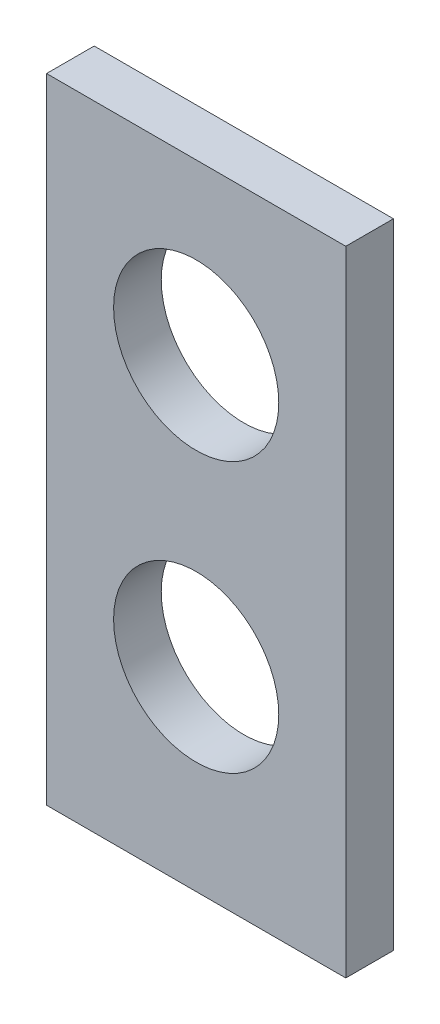
ISO-10303-21;
HEADER;
FILE_DESCRIPTION(('STEP AP214'),'2;1');
FILE_NAME('part.step','',(''),(''),'','','');
FILE_SCHEMA(('AUTOMOTIVE_DESIGN { 1 0 10303 214 1 1 1 1 }'));
ENDSEC;
DATA;
#1=APPLICATION_CONTEXT('core data for automotive mechanical design processes');
#2=APPLICATION_PROTOCOL_DEFINITION('international standard','automotive_design',2000,#1);
#3=PRODUCT_CONTEXT('',#1,'mechanical');
#4=PRODUCT('Part','Part','',(#3));
#5=PRODUCT_RELATED_PRODUCT_CATEGORY('part','',(#4));
#6=PRODUCT_DEFINITION_FORMATION('','',#4);
#7=PRODUCT_DEFINITION_CONTEXT('part definition',#1,'design');
#8=PRODUCT_DEFINITION('design','',#6,#7);
#9=PRODUCT_DEFINITION_SHAPE('','',#8);
#10=(LENGTH_UNIT() NAMED_UNIT(*) SI_UNIT(.MILLI.,.METRE.));
#11=(NAMED_UNIT(*) PLANE_ANGLE_UNIT() SI_UNIT($,.RADIAN.));
#12=(NAMED_UNIT(*) SI_UNIT($,.STERADIAN.) SOLID_ANGLE_UNIT());
#13=UNCERTAINTY_MEASURE_WITH_UNIT(LENGTH_MEASURE(1.E-05),#10,'distance_accuracy_value','');
#14=(GEOMETRIC_REPRESENTATION_CONTEXT(3) GLOBAL_UNCERTAINTY_ASSIGNED_CONTEXT((#13)) GLOBAL_UNIT_ASSIGNED_CONTEXT((#10,
#11,#12)) REPRESENTATION_CONTEXT('',''));
#15=CARTESIAN_POINT('',(0.,0.,0.));
#16=DIRECTION('',(0.,0.,1.));
#17=DIRECTION('',(1.,0.,0.));
#18=AXIS2_PLACEMENT_3D('',#15,#16,#17);
#19=CARTESIAN_POINT('',(-47.1019241599774,-99.7516359879327,15.));
#20=DIRECTION('',(0.,0.,1.));
#21=DIRECTION('',(1.,0.,0.));
#22=AXIS2_PLACEMENT_3D('',#19,#20,#21);
#23=PLANE('',#22);
#24=CARTESIAN_POINT('',(0.,46.5176563279375,15.));
#25=DIRECTION('',(0.,0.,1.));
#26=DIRECTION('',(1.,0.,0.));
#27=AXIS2_PLACEMENT_3D('',#24,#25,#26);
#28=CIRCLE('',#27,26.);
#29=CARTESIAN_POINT('',(26.,46.5176563279375,15.));
#30=VERTEX_POINT('',#29);
#31=EDGE_CURVE('E101',#30,#30,#28,.T.);
#32=ORIENTED_EDGE('',*,*,#31,.F.);
#33=EDGE_LOOP('',(#32));
#34=FACE_BOUND('',#33,.T.);
#35=DIRECTION('',(0.,-1.,0.));
#36=VECTOR('',#35,1.);
#37=CARTESIAN_POINT('',(-47.1019241599774,99.7516359879326,15.));
#38=LINE('',#37,#36);
#39=CARTESIAN_POINT('',(-47.1019241599774,99.7516359879326,15.));
#40=VERTEX_POINT('',#39);
#41=CARTESIAN_POINT('',(-47.1019241599774,-99.7516359879327,15.));
#42=VERTEX_POINT('',#41);
#43=EDGE_CURVE('E86',#40,#42,#38,.T.);
#44=ORIENTED_EDGE('',*,*,#43,.T.);
#45=DIRECTION('',(1.,0.,0.));
#46=VECTOR('',#45,1.);
#47=CARTESIAN_POINT('',(-47.1019241599774,-99.7516359879327,15.));
#48=LINE('',#47,#46);
#49=CARTESIAN_POINT('',(47.1019241599774,-99.7516359879327,15.));
#50=VERTEX_POINT('',#49);
#51=EDGE_CURVE('E81',#42,#50,#48,.T.);
#52=ORIENTED_EDGE('',*,*,#51,.T.);
#53=DIRECTION('',(0.,1.,0.));
#54=VECTOR('',#53,1.);
#55=CARTESIAN_POINT('',(47.1019241599774,99.7516359879326,15.));
#56=LINE('',#55,#54);
#57=CARTESIAN_POINT('',(47.1019241599774,99.7516359879326,15.));
#58=VERTEX_POINT('',#57);
#59=EDGE_CURVE('E84',#50,#58,#56,.T.);
#60=ORIENTED_EDGE('',*,*,#59,.T.);
#61=DIRECTION('',(-1.,0.,0.));
#62=VECTOR('',#61,1.);
#63=CARTESIAN_POINT('',(-47.1019241599774,99.7516359879326,15.));
#64=LINE('',#63,#62);
#65=EDGE_CURVE('E51',#58,#40,#64,.T.);
#66=ORIENTED_EDGE('',*,*,#65,.T.);
#67=EDGE_LOOP('',(#44,#52,#60,#66));
#68=FACE_BOUND('',#67,.T.);
#69=CARTESIAN_POINT('',(0.,-38.4823436720625,15.));
#70=DIRECTION('',(0.,0.,1.));
#71=DIRECTION('',(1.,0.,0.));
#72=AXIS2_PLACEMENT_3D('',#69,#70,#71);
#73=CIRCLE('',#72,26.);
#74=CARTESIAN_POINT('',(26.,-38.4823436720625,15.));
#75=VERTEX_POINT('',#74);
#76=EDGE_CURVE('E116',#75,#75,#73,.T.);
#77=ORIENTED_EDGE('',*,*,#76,.F.);
#78=EDGE_LOOP('',(#77));
#79=FACE_BOUND('',#78,.T.);
#80=ADVANCED_FACE('F34',(#34,#68,#79),#23,.T.);
#81=CARTESIAN_POINT('',(-47.1019241599774,-99.7516359879327,0.));
#82=DIRECTION('',(0.,0.,1.));
#83=DIRECTION('',(1.,0.,0.));
#84=AXIS2_PLACEMENT_3D('',#81,#82,#83);
#85=PLANE('',#84);
#86=CARTESIAN_POINT('',(0.,46.5176563279375,0.));
#87=DIRECTION('',(0.,0.,1.));
#88=DIRECTION('',(1.,0.,0.));
#89=AXIS2_PLACEMENT_3D('',#86,#87,#88);
#90=CIRCLE('',#89,26.);
#91=CARTESIAN_POINT('',(26.,46.5176563279375,0.));
#92=VERTEX_POINT('',#91);
#93=EDGE_CURVE('E113',#92,#92,#90,.T.);
#94=ORIENTED_EDGE('',*,*,#93,.T.);
#95=EDGE_LOOP('',(#94));
#96=FACE_BOUND('',#95,.T.);
#97=DIRECTION('',(0.,-1.,0.));
#98=VECTOR('',#97,1.);
#99=CARTESIAN_POINT('',(-47.1019241599774,99.7516359879326,0.));
#100=LINE('',#99,#98);
#101=CARTESIAN_POINT('',(-47.1019241599774,99.7516359879326,0.));
#102=VERTEX_POINT('',#101);
#103=CARTESIAN_POINT('',(-47.1019241599774,-99.7516359879327,0.));
#104=VERTEX_POINT('',#103);
#105=EDGE_CURVE('E98',#102,#104,#100,.T.);
#106=ORIENTED_EDGE('',*,*,#105,.F.);
#107=DIRECTION('',(-1.,0.,0.));
#108=VECTOR('',#107,1.);
#109=CARTESIAN_POINT('',(-47.1019241599774,99.7516359879326,0.));
#110=LINE('',#109,#108);
#111=CARTESIAN_POINT('',(47.1019241599774,99.7516359879326,0.));
#112=VERTEX_POINT('',#111);
#113=EDGE_CURVE('E74',#112,#102,#110,.T.);
#114=ORIENTED_EDGE('',*,*,#113,.F.);
#115=DIRECTION('',(0.,1.,0.));
#116=VECTOR('',#115,1.);
#117=CARTESIAN_POINT('',(47.1019241599774,99.7516359879326,0.));
#118=LINE('',#117,#116);
#119=CARTESIAN_POINT('',(47.1019241599774,-99.7516359879327,0.));
#120=VERTEX_POINT('',#119);
#121=EDGE_CURVE('E68',#120,#112,#118,.T.);
#122=ORIENTED_EDGE('',*,*,#121,.F.);
#123=DIRECTION('',(1.,0.,0.));
#124=VECTOR('',#123,1.);
#125=CARTESIAN_POINT('',(-47.1019241599774,-99.7516359879327,0.));
#126=LINE('',#125,#124);
#127=EDGE_CURVE('E90',#104,#120,#126,.T.);
#128=ORIENTED_EDGE('',*,*,#127,.F.);
#129=EDGE_LOOP('',(#106,#114,#122,#128));
#130=FACE_BOUND('',#129,.T.);
#131=CARTESIAN_POINT('',(0.,-38.4823436720625,0.));
#132=DIRECTION('',(0.,0.,1.));
#133=DIRECTION('',(1.,0.,0.));
#134=AXIS2_PLACEMENT_3D('',#131,#132,#133);
#135=CIRCLE('',#134,26.);
#136=CARTESIAN_POINT('',(26.,-38.4823436720625,0.));
#137=VERTEX_POINT('',#136);
#138=EDGE_CURVE('E119',#137,#137,#135,.T.);
#139=ORIENTED_EDGE('',*,*,#138,.T.);
#140=EDGE_LOOP('',(#139));
#141=FACE_BOUND('',#140,.T.);
#142=ADVANCED_FACE('F109',(#96,#130,#141),#85,.F.);
#143=CARTESIAN_POINT('',(-47.1019241599774,99.7516359879326,15.));
#144=DIRECTION('',(1.,0.,0.));
#145=DIRECTION('',(0.,1.,0.));
#146=AXIS2_PLACEMENT_3D('',#143,#144,#145);
#147=PLANE('',#146);
#148=ORIENTED_EDGE('',*,*,#105,.T.);
#149=DIRECTION('',(0.,0.,-1.));
#150=VECTOR('',#149,1.);
#151=CARTESIAN_POINT('',(-47.1019241599774,-99.7516359879327,15.));
#152=LINE('',#151,#150);
#153=EDGE_CURVE('E11',#42,#104,#152,.T.);
#154=ORIENTED_EDGE('',*,*,#153,.F.);
#155=ORIENTED_EDGE('',*,*,#43,.F.);
#156=DIRECTION('',(0.,0.,-1.));
#157=VECTOR('',#156,1.);
#158=CARTESIAN_POINT('',(-47.1019241599774,99.7516359879326,15.));
#159=LINE('',#158,#157);
#160=EDGE_CURVE('E94',#40,#102,#159,.T.);
#161=ORIENTED_EDGE('',*,*,#160,.T.);
#162=EDGE_LOOP('',(#148,#154,#155,#161));
#163=FACE_BOUND('',#162,.T.);
#164=ADVANCED_FACE('F36',(#163),#147,.F.);
#165=CARTESIAN_POINT('',(-47.1019241599774,-99.7516359879327,15.));
#166=DIRECTION('',(0.,1.,0.));
#167=DIRECTION('',(0.,0.,1.));
#168=AXIS2_PLACEMENT_3D('',#165,#166,#167);
#169=PLANE('',#168);
#170=ORIENTED_EDGE('',*,*,#127,.T.);
#171=DIRECTION('',(0.,0.,-1.));
#172=VECTOR('',#171,1.);
#173=CARTESIAN_POINT('',(47.1019241599774,-99.7516359879327,15.));
#174=LINE('',#173,#172);
#175=EDGE_CURVE('E43',#50,#120,#174,.T.);
#176=ORIENTED_EDGE('',*,*,#175,.F.);
#177=ORIENTED_EDGE('',*,*,#51,.F.);
#178=ORIENTED_EDGE('',*,*,#153,.T.);
#179=EDGE_LOOP('',(#170,#176,#177,#178));
#180=FACE_BOUND('',#179,.T.);
#181=ADVANCED_FACE('F89',(#180),#169,.F.);
#182=CARTESIAN_POINT('',(47.1019241599774,99.7516359879326,15.));
#183=DIRECTION('',(-1.,0.,0.));
#184=DIRECTION('',(0.,-1.,0.));
#185=AXIS2_PLACEMENT_3D('',#182,#183,#184);
#186=PLANE('',#185);
#187=ORIENTED_EDGE('',*,*,#121,.T.);
#188=DIRECTION('',(0.,0.,-1.));
#189=VECTOR('',#188,1.);
#190=CARTESIAN_POINT('',(47.1019241599774,99.7516359879326,15.));
#191=LINE('',#190,#189);
#192=EDGE_CURVE('E91',#58,#112,#191,.T.);
#193=ORIENTED_EDGE('',*,*,#192,.F.);
#194=ORIENTED_EDGE('',*,*,#59,.F.);
#195=ORIENTED_EDGE('',*,*,#175,.T.);
#196=EDGE_LOOP('',(#187,#193,#194,#195));
#197=FACE_BOUND('',#196,.T.);
#198=ADVANCED_FACE('F92',(#197),#186,.F.);
#199=CARTESIAN_POINT('',(-47.1019241599774,99.7516359879326,15.));
#200=DIRECTION('',(0.,-1.,0.));
#201=DIRECTION('',(0.,0.,-1.));
#202=AXIS2_PLACEMENT_3D('',#199,#200,#201);
#203=PLANE('',#202);
#204=ORIENTED_EDGE('',*,*,#113,.T.);
#205=ORIENTED_EDGE('',*,*,#160,.F.);
#206=ORIENTED_EDGE('',*,*,#65,.F.);
#207=ORIENTED_EDGE('',*,*,#192,.T.);
#208=EDGE_LOOP('',(#204,#205,#206,#207));
#209=FACE_BOUND('',#208,.T.);
#210=ADVANCED_FACE('F106',(#209),#203,.F.);
#211=CARTESIAN_POINT('',(0.,46.5176563279375,15.));
#212=DIRECTION('',(0.,0.,-1.));
#213=DIRECTION('',(-1.,0.,0.));
#214=AXIS2_PLACEMENT_3D('',#211,#212,#213);
#215=CYLINDRICAL_SURFACE('',#214,26.);
#216=ORIENTED_EDGE('',*,*,#31,.T.);
#217=EDGE_LOOP('',(#216));
#218=FACE_BOUND('',#217,.T.);
#219=ORIENTED_EDGE('',*,*,#93,.F.);
#220=EDGE_LOOP('',(#219));
#221=FACE_BOUND('',#220,.T.);
#222=ADVANCED_FACE('F137',(#218,#221),#215,.F.);
#223=CARTESIAN_POINT('',(0.,-38.4823436720625,15.));
#224=DIRECTION('',(0.,0.,-1.));
#225=DIRECTION('',(-1.,0.,0.));
#226=AXIS2_PLACEMENT_3D('',#223,#224,#225);
#227=CYLINDRICAL_SURFACE('',#226,26.);
#228=ORIENTED_EDGE('',*,*,#76,.T.);
#229=EDGE_LOOP('',(#228));
#230=FACE_BOUND('',#229,.T.);
#231=ORIENTED_EDGE('',*,*,#138,.F.);
#232=EDGE_LOOP('',(#231));
#233=FACE_BOUND('',#232,.T.);
#234=ADVANCED_FACE('F125',(#230,#233),#227,.F.);
#235=CLOSED_SHELL('',(#80,#142,#164,#181,#198,#210,#222,#234));
#236=MANIFOLD_SOLID_BREP('B2',#235);
#237=ADVANCED_BREP_SHAPE_REPRESENTATION('',(#18,#236),#14);
#238=SHAPE_DEFINITION_REPRESENTATION(#9,#237);
ENDSEC;
END-ISO-10303-21;
